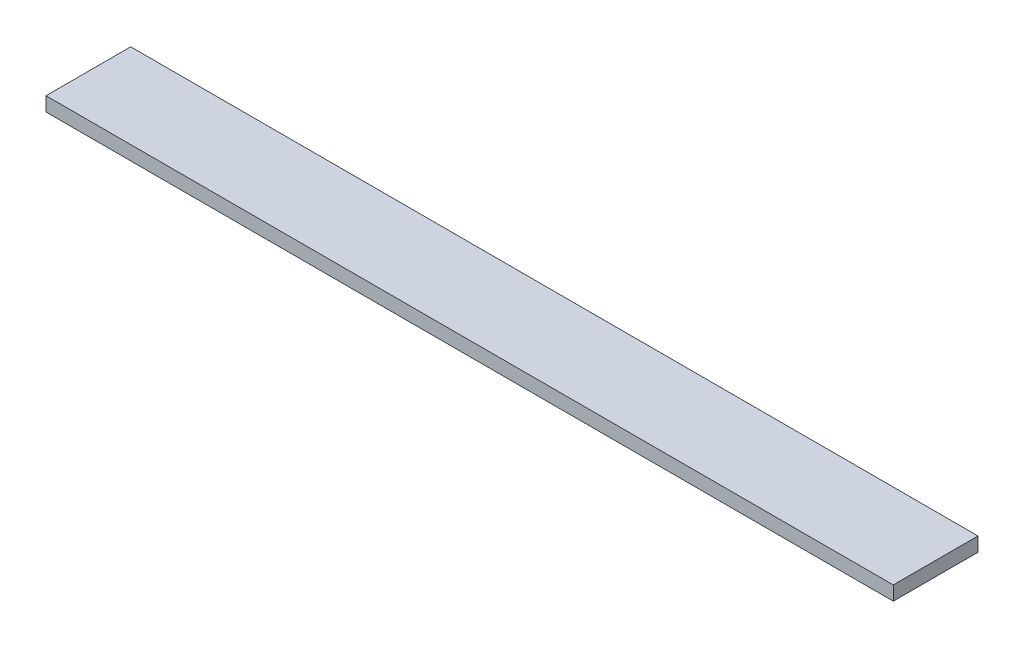
ISO-10303-21;
HEADER;
FILE_DESCRIPTION(('STEP AP214'),'2;1');
FILE_NAME('part.step','',(''),(''),'','','');
FILE_SCHEMA(('AUTOMOTIVE_DESIGN { 1 0 10303 214 1 1 1 1 }'));
ENDSEC;
DATA;
#1=APPLICATION_CONTEXT('core data for automotive mechanical design processes');
#2=APPLICATION_PROTOCOL_DEFINITION('international standard','automotive_design',2000,#1);
#3=PRODUCT_CONTEXT('',#1,'mechanical');
#4=PRODUCT('Part','Part','',(#3));
#5=PRODUCT_RELATED_PRODUCT_CATEGORY('part','',(#4));
#6=PRODUCT_DEFINITION_FORMATION('','',#4);
#7=PRODUCT_DEFINITION_CONTEXT('part definition',#1,'design');
#8=PRODUCT_DEFINITION('design','',#6,#7);
#9=PRODUCT_DEFINITION_SHAPE('','',#8);
#10=(LENGTH_UNIT() NAMED_UNIT(*) SI_UNIT(.MILLI.,.METRE.));
#11=(NAMED_UNIT(*) PLANE_ANGLE_UNIT() SI_UNIT($,.RADIAN.));
#12=(NAMED_UNIT(*) SI_UNIT($,.STERADIAN.) SOLID_ANGLE_UNIT());
#13=UNCERTAINTY_MEASURE_WITH_UNIT(LENGTH_MEASURE(1.E-05),#10,'distance_accuracy_value','');
#14=(GEOMETRIC_REPRESENTATION_CONTEXT(3) GLOBAL_UNCERTAINTY_ASSIGNED_CONTEXT((#13)) GLOBAL_UNIT_ASSIGNED_CONTEXT((#10,
#11,#12)) REPRESENTATION_CONTEXT('',''));
#15=CARTESIAN_POINT('',(0.,0.,0.));
#16=DIRECTION('',(0.,0.,1.));
#17=DIRECTION('',(1.,0.,0.));
#18=AXIS2_PLACEMENT_3D('',#15,#16,#17);
#19=CARTESIAN_POINT('',(0.,10.,0.));
#20=DIRECTION('',(1.,0.,0.));
#21=DIRECTION('',(0.,0.,-1.));
#22=AXIS2_PLACEMENT_3D('',#19,#20,#21);
#23=PLANE('',#22);
#24=DIRECTION('',(0.,0.,1.));
#25=VECTOR('',#24,1.);
#26=CARTESIAN_POINT('',(0.,0.,0.));
#27=LINE('',#26,#25);
#28=CARTESIAN_POINT('',(0.,0.,0.));
#29=VERTEX_POINT('',#28);
#30=CARTESIAN_POINT('',(0.,0.,60.));
#31=VERTEX_POINT('',#30);
#32=EDGE_CURVE('E107',#29,#31,#27,.T.);
#33=ORIENTED_EDGE('',*,*,#32,.T.);
#34=DIRECTION('',(0.,-1.,0.));
#35=VECTOR('',#34,1.);
#36=CARTESIAN_POINT('',(0.,10.,60.));
#37=LINE('',#36,#35);
#38=CARTESIAN_POINT('',(0.,10.,60.));
#39=VERTEX_POINT('',#38);
#40=EDGE_CURVE('E11',#39,#31,#37,.T.);
#41=ORIENTED_EDGE('',*,*,#40,.F.);
#42=DIRECTION('',(0.,0.,1.));
#43=VECTOR('',#42,1.);
#44=CARTESIAN_POINT('',(0.,10.,0.));
#45=LINE('',#44,#43);
#46=CARTESIAN_POINT('',(0.,10.,0.));
#47=VERTEX_POINT('',#46);
#48=EDGE_CURVE('E91',#47,#39,#45,.T.);
#49=ORIENTED_EDGE('',*,*,#48,.F.);
#50=DIRECTION('',(0.,-1.,0.));
#51=VECTOR('',#50,1.);
#52=CARTESIAN_POINT('',(0.,10.,0.));
#53=LINE('',#52,#51);
#54=EDGE_CURVE('E103',#47,#29,#53,.T.);
#55=ORIENTED_EDGE('',*,*,#54,.T.);
#56=EDGE_LOOP('',(#33,#41,#49,#55));
#57=FACE_BOUND('',#56,.T.);
#58=ADVANCED_FACE('F39',(#57),#23,.F.);
#59=CARTESIAN_POINT('',(0.,10.,60.));
#60=DIRECTION('',(0.,0.,-1.));
#61=DIRECTION('',(-1.,0.,0.));
#62=AXIS2_PLACEMENT_3D('',#59,#60,#61);
#63=PLANE('',#62);
#64=DIRECTION('',(1.,0.,0.));
#65=VECTOR('',#64,1.);
#66=CARTESIAN_POINT('',(0.,0.,60.));
#67=LINE('',#66,#65);
#68=CARTESIAN_POINT('',(600.,0.,60.));
#69=VERTEX_POINT('',#68);
#70=EDGE_CURVE('E96',#31,#69,#67,.T.);
#71=ORIENTED_EDGE('',*,*,#70,.T.);
#72=DIRECTION('',(0.,-1.,0.));
#73=VECTOR('',#72,1.);
#74=CARTESIAN_POINT('',(600.,10.,60.));
#75=LINE('',#74,#73);
#76=CARTESIAN_POINT('',(600.,10.,60.));
#77=VERTEX_POINT('',#76);
#78=EDGE_CURVE('E48',#77,#69,#75,.T.);
#79=ORIENTED_EDGE('',*,*,#78,.F.);
#80=DIRECTION('',(1.,0.,0.));
#81=VECTOR('',#80,1.);
#82=CARTESIAN_POINT('',(0.,10.,60.));
#83=LINE('',#82,#81);
#84=EDGE_CURVE('E86',#39,#77,#83,.T.);
#85=ORIENTED_EDGE('',*,*,#84,.F.);
#86=ORIENTED_EDGE('',*,*,#40,.T.);
#87=EDGE_LOOP('',(#71,#79,#85,#86));
#88=FACE_BOUND('',#87,.T.);
#89=ADVANCED_FACE('F95',(#88),#63,.F.);
#90=CARTESIAN_POINT('',(600.,10.,0.));
#91=DIRECTION('',(-1.,0.,0.));
#92=DIRECTION('',(0.,0.,1.));
#93=AXIS2_PLACEMENT_3D('',#90,#91,#92);
#94=PLANE('',#93);
#95=DIRECTION('',(0.,0.,-1.));
#96=VECTOR('',#95,1.);
#97=CARTESIAN_POINT('',(600.,0.,0.));
#98=LINE('',#97,#96);
#99=CARTESIAN_POINT('',(600.,0.,0.));
#100=VERTEX_POINT('',#99);
#101=EDGE_CURVE('E73',#69,#100,#98,.T.);
#102=ORIENTED_EDGE('',*,*,#101,.T.);
#103=DIRECTION('',(0.,-1.,0.));
#104=VECTOR('',#103,1.);
#105=CARTESIAN_POINT('',(600.,10.,0.));
#106=LINE('',#105,#104);
#107=CARTESIAN_POINT('',(600.,10.,0.));
#108=VERTEX_POINT('',#107);
#109=EDGE_CURVE('E98',#108,#100,#106,.T.);
#110=ORIENTED_EDGE('',*,*,#109,.F.);
#111=DIRECTION('',(0.,0.,-1.));
#112=VECTOR('',#111,1.);
#113=CARTESIAN_POINT('',(600.,10.,0.));
#114=LINE('',#113,#112);
#115=EDGE_CURVE('E89',#77,#108,#114,.T.);
#116=ORIENTED_EDGE('',*,*,#115,.F.);
#117=ORIENTED_EDGE('',*,*,#78,.T.);
#118=EDGE_LOOP('',(#102,#110,#116,#117));
#119=FACE_BOUND('',#118,.T.);
#120=ADVANCED_FACE('F99',(#119),#94,.F.);
#121=CARTESIAN_POINT('',(0.,10.,0.));
#122=DIRECTION('',(0.,0.,1.));
#123=DIRECTION('',(1.,0.,0.));
#124=AXIS2_PLACEMENT_3D('',#121,#122,#123);
#125=PLANE('',#124);
#126=DIRECTION('',(-1.,0.,0.));
#127=VECTOR('',#126,1.);
#128=CARTESIAN_POINT('',(0.,0.,0.));
#129=LINE('',#128,#127);
#130=EDGE_CURVE('E79',#100,#29,#129,.T.);
#131=ORIENTED_EDGE('',*,*,#130,.T.);
#132=ORIENTED_EDGE('',*,*,#54,.F.);
#133=DIRECTION('',(-1.,0.,0.));
#134=VECTOR('',#133,1.);
#135=CARTESIAN_POINT('',(0.,10.,0.));
#136=LINE('',#135,#134);
#137=EDGE_CURVE('E56',#108,#47,#136,.T.);
#138=ORIENTED_EDGE('',*,*,#137,.F.);
#139=ORIENTED_EDGE('',*,*,#109,.T.);
#140=EDGE_LOOP('',(#131,#132,#138,#139));
#141=FACE_BOUND('',#140,.T.);
#142=ADVANCED_FACE('F120',(#141),#125,.F.);
#143=CARTESIAN_POINT('',(0.,10.,0.));
#144=DIRECTION('',(0.,1.,0.));
#145=DIRECTION('',(0.,0.,1.));
#146=AXIS2_PLACEMENT_3D('',#143,#144,#145);
#147=PLANE('',#146);
#148=ORIENTED_EDGE('',*,*,#48,.T.);
#149=ORIENTED_EDGE('',*,*,#84,.T.);
#150=ORIENTED_EDGE('',*,*,#115,.T.);
#151=ORIENTED_EDGE('',*,*,#137,.T.);
#152=EDGE_LOOP('',(#148,#149,#150,#151));
#153=FACE_BOUND('',#152,.T.);
#154=ADVANCED_FACE('F87',(#153),#147,.T.);
#155=CARTESIAN_POINT('',(0.,0.,0.));
#156=DIRECTION('',(0.,1.,0.));
#157=DIRECTION('',(0.,0.,1.));
#158=AXIS2_PLACEMENT_3D('',#155,#156,#157);
#159=PLANE('',#158);
#160=ORIENTED_EDGE('',*,*,#32,.F.);
#161=ORIENTED_EDGE('',*,*,#130,.F.);
#162=ORIENTED_EDGE('',*,*,#101,.F.);
#163=ORIENTED_EDGE('',*,*,#70,.F.);
#164=EDGE_LOOP('',(#160,#161,#162,#163));
#165=FACE_BOUND('',#164,.T.);
#166=ADVANCED_FACE('F123',(#165),#159,.F.);
#167=CLOSED_SHELL('',(#58,#89,#120,#142,#154,#166));
#168=MANIFOLD_SOLID_BREP('B2',#167);
#169=ADVANCED_BREP_SHAPE_REPRESENTATION('',(#18,#168),#14);
#170=SHAPE_DEFINITION_REPRESENTATION(#9,#169);
ENDSEC;
END-ISO-10303-21;
